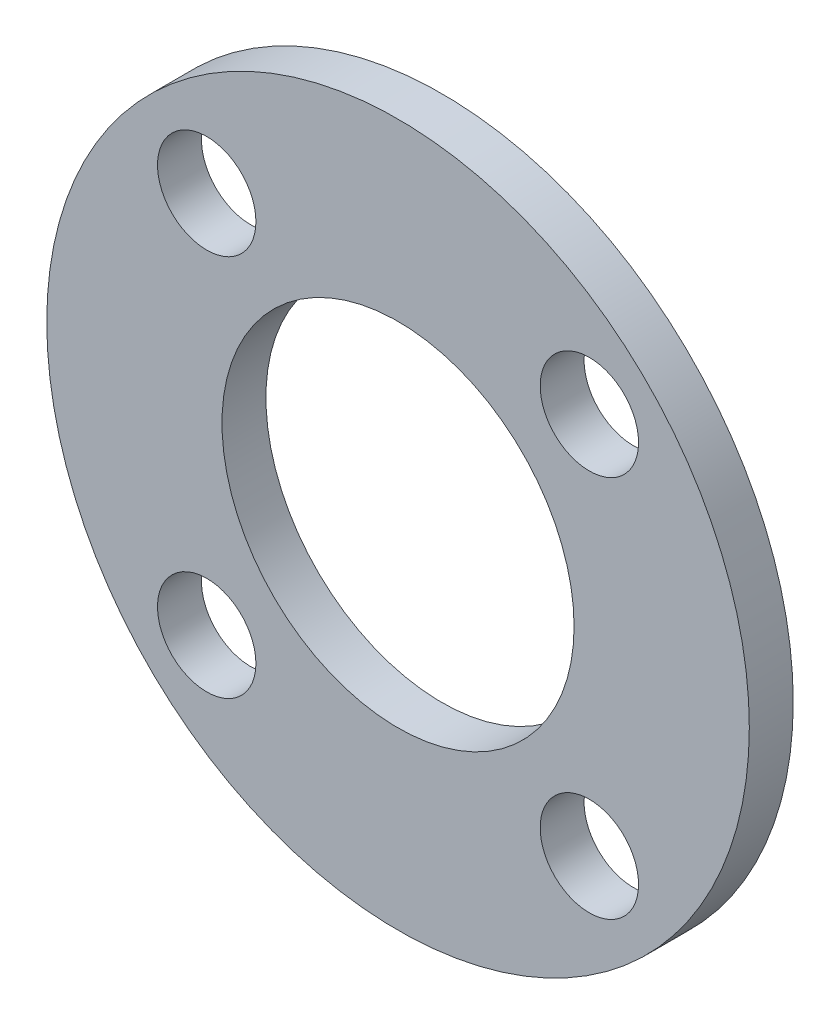
ISO-10303-21;
HEADER;
FILE_DESCRIPTION(('STEP AP214'),'2;1');
FILE_NAME('part.step','',(''),(''),'','','');
FILE_SCHEMA(('AUTOMOTIVE_DESIGN { 1 0 10303 214 1 1 1 1 }'));
ENDSEC;
DATA;
#1=APPLICATION_CONTEXT('core data for automotive mechanical design processes');
#2=APPLICATION_PROTOCOL_DEFINITION('international standard','automotive_design',2000,#1);
#3=PRODUCT_CONTEXT('',#1,'mechanical');
#4=PRODUCT('Part','Part','',(#3));
#5=PRODUCT_RELATED_PRODUCT_CATEGORY('part','',(#4));
#6=PRODUCT_DEFINITION_FORMATION('','',#4);
#7=PRODUCT_DEFINITION_CONTEXT('part definition',#1,'design');
#8=PRODUCT_DEFINITION('design','',#6,#7);
#9=PRODUCT_DEFINITION_SHAPE('','',#8);
#10=(LENGTH_UNIT() NAMED_UNIT(*) SI_UNIT(.MILLI.,.METRE.));
#11=(NAMED_UNIT(*) PLANE_ANGLE_UNIT() SI_UNIT($,.RADIAN.));
#12=(NAMED_UNIT(*) SI_UNIT($,.STERADIAN.) SOLID_ANGLE_UNIT());
#13=UNCERTAINTY_MEASURE_WITH_UNIT(LENGTH_MEASURE(1.E-05),#10,'distance_accuracy_value','');
#14=(GEOMETRIC_REPRESENTATION_CONTEXT(3) GLOBAL_UNCERTAINTY_ASSIGNED_CONTEXT((#13)) GLOBAL_UNIT_ASSIGNED_CONTEXT((#10,
#11,#12)) REPRESENTATION_CONTEXT('',''));
#15=CARTESIAN_POINT('',(0.,0.,0.));
#16=DIRECTION('',(0.,0.,1.));
#17=DIRECTION('',(1.,0.,0.));
#18=AXIS2_PLACEMENT_3D('',#15,#16,#17);
#19=CARTESIAN_POINT('',(0.,0.,3.175));
#20=DIRECTION('',(0.,0.,-1.));
#21=DIRECTION('',(-1.,0.,0.));
#22=AXIS2_PLACEMENT_3D('',#19,#20,#21);
#23=CYLINDRICAL_SURFACE('',#22,12.69619);
#24=CARTESIAN_POINT('',(0.,0.,0.));
#25=DIRECTION('',(0.,0.,-1.));
#26=DIRECTION('',(-1.,0.,0.));
#27=AXIS2_PLACEMENT_3D('',#24,#25,#26);
#28=CIRCLE('',#27,12.69619);
#29=CARTESIAN_POINT('',(-12.69619,0.,0.));
#30=VERTEX_POINT('',#29);
#31=EDGE_CURVE('E12',#30,#30,#28,.F.);
#32=ORIENTED_EDGE('',*,*,#31,.T.);
#33=EDGE_LOOP('',(#32));
#34=FACE_BOUND('',#33,.T.);
#35=CARTESIAN_POINT('',(0.,0.,1.5875));
#36=DIRECTION('',(0.,0.,1.));
#37=DIRECTION('',(1.,0.,0.));
#38=AXIS2_PLACEMENT_3D('',#35,#36,#37);
#39=CIRCLE('',#38,12.69619);
#40=CARTESIAN_POINT('',(12.69619,0.,1.5875));
#41=VERTEX_POINT('',#40);
#42=EDGE_CURVE('E89',#41,#41,#39,.F.);
#43=ORIENTED_EDGE('',*,*,#42,.T.);
#44=EDGE_LOOP('',(#43));
#45=FACE_BOUND('',#44,.T.);
#46=ADVANCED_FACE('F55',(#34,#45),#23,.T.);
#47=CARTESIAN_POINT('',(0.,0.,3.175));
#48=DIRECTION('',(0.,0.,1.));
#49=DIRECTION('',(1.,0.,0.));
#50=AXIS2_PLACEMENT_3D('',#47,#48,#49);
#51=CYLINDRICAL_SURFACE('',#50,6.36270000000001);
#52=CARTESIAN_POINT('',(0.,0.,0.));
#53=DIRECTION('',(0.,0.,1.));
#54=DIRECTION('',(1.,0.,0.));
#55=AXIS2_PLACEMENT_3D('',#52,#53,#54);
#56=CIRCLE('',#55,6.36270000000001);
#57=CARTESIAN_POINT('',(6.36270000000001,0.,0.));
#58=VERTEX_POINT('',#57);
#59=EDGE_CURVE('E65',#58,#58,#56,.T.);
#60=ORIENTED_EDGE('',*,*,#59,.F.);
#61=EDGE_LOOP('',(#60));
#62=FACE_BOUND('',#61,.T.);
#63=CARTESIAN_POINT('',(0.,0.,1.5875));
#64=DIRECTION('',(0.,0.,1.));
#65=DIRECTION('',(1.,0.,0.));
#66=AXIS2_PLACEMENT_3D('',#63,#64,#65);
#67=CIRCLE('',#66,6.36270000000001);
#68=CARTESIAN_POINT('',(6.36270000000001,0.,1.5875));
#69=VERTEX_POINT('',#68);
#70=EDGE_CURVE('E93',#69,#69,#67,.F.);
#71=ORIENTED_EDGE('',*,*,#70,.F.);
#72=EDGE_LOOP('',(#71));
#73=FACE_BOUND('',#72,.T.);
#74=ADVANCED_FACE('F133',(#62,#73),#51,.F.);
#75=CARTESIAN_POINT('',(-6.91479721322323,6.91479721322326,3.175));
#76=DIRECTION('',(0.,0.,1.));
#77=DIRECTION('',(1.,0.,0.));
#78=AXIS2_PLACEMENT_3D('',#75,#76,#77);
#79=CYLINDRICAL_SURFACE('',#78,1.77799999999998);
#80=CARTESIAN_POINT('',(-6.91479721322323,6.91479721322326,0.));
#81=DIRECTION('',(0.,0.,1.));
#82=DIRECTION('',(1.,0.,0.));
#83=AXIS2_PLACEMENT_3D('',#80,#81,#82);
#84=CIRCLE('',#83,1.77799999999998);
#85=CARTESIAN_POINT('',(-5.13679721322325,6.91479721322326,0.));
#86=VERTEX_POINT('',#85);
#87=EDGE_CURVE('E71',#86,#86,#84,.T.);
#88=ORIENTED_EDGE('',*,*,#87,.F.);
#89=EDGE_LOOP('',(#88));
#90=FACE_BOUND('',#89,.T.);
#91=CARTESIAN_POINT('',(-6.91479721322323,6.91479721322326,1.5875));
#92=DIRECTION('',(0.,0.,1.));
#93=DIRECTION('',(1.,0.,0.));
#94=AXIS2_PLACEMENT_3D('',#91,#92,#93);
#95=CIRCLE('',#94,1.77799999999998);
#96=CARTESIAN_POINT('',(-5.13679721322325,6.91479721322326,1.5875));
#97=VERTEX_POINT('',#96);
#98=EDGE_CURVE('E97',#97,#97,#95,.F.);
#99=ORIENTED_EDGE('',*,*,#98,.F.);
#100=EDGE_LOOP('',(#99));
#101=FACE_BOUND('',#100,.T.);
#102=ADVANCED_FACE('F137',(#90,#101),#79,.F.);
#103=CARTESIAN_POINT('',(6.91479721322328,6.91479721322321,3.175));
#104=DIRECTION('',(0.,0.,1.));
#105=DIRECTION('',(1.,0.,0.));
#106=AXIS2_PLACEMENT_3D('',#103,#104,#105);
#107=CYLINDRICAL_SURFACE('',#106,1.77799999999998);
#108=CARTESIAN_POINT('',(6.91479721322328,6.91479721322321,0.));
#109=DIRECTION('',(0.,0.,1.));
#110=DIRECTION('',(1.,0.,0.));
#111=AXIS2_PLACEMENT_3D('',#108,#109,#110);
#112=CIRCLE('',#111,1.77799999999998);
#113=CARTESIAN_POINT('',(8.69279721322327,6.91479721322321,0.));
#114=VERTEX_POINT('',#113);
#115=EDGE_CURVE('E77',#114,#114,#112,.T.);
#116=ORIENTED_EDGE('',*,*,#115,.F.);
#117=EDGE_LOOP('',(#116));
#118=FACE_BOUND('',#117,.T.);
#119=CARTESIAN_POINT('',(6.91479721322328,6.91479721322321,1.5875));
#120=DIRECTION('',(0.,0.,1.));
#121=DIRECTION('',(1.,0.,0.));
#122=AXIS2_PLACEMENT_3D('',#119,#120,#121);
#123=CIRCLE('',#122,1.77799999999998);
#124=CARTESIAN_POINT('',(8.69279721322327,6.91479721322321,1.5875));
#125=VERTEX_POINT('',#124);
#126=EDGE_CURVE('E101',#125,#125,#123,.F.);
#127=ORIENTED_EDGE('',*,*,#126,.F.);
#128=EDGE_LOOP('',(#127));
#129=FACE_BOUND('',#128,.T.);
#130=ADVANCED_FACE('F127',(#118,#129),#107,.F.);
#131=CARTESIAN_POINT('',(6.91479721322323,-6.91479721322326,3.175));
#132=DIRECTION('',(0.,0.,1.));
#133=DIRECTION('',(1.,0.,0.));
#134=AXIS2_PLACEMENT_3D('',#131,#132,#133);
#135=CYLINDRICAL_SURFACE('',#134,1.77799999999999);
#136=CARTESIAN_POINT('',(6.91479721322323,-6.91479721322326,0.));
#137=DIRECTION('',(0.,0.,1.));
#138=DIRECTION('',(1.,0.,0.));
#139=AXIS2_PLACEMENT_3D('',#136,#137,#138);
#140=CIRCLE('',#139,1.77799999999999);
#141=CARTESIAN_POINT('',(8.69279721322322,-6.91479721322326,0.));
#142=VERTEX_POINT('',#141);
#143=EDGE_CURVE('E81',#142,#142,#140,.T.);
#144=ORIENTED_EDGE('',*,*,#143,.F.);
#145=EDGE_LOOP('',(#144));
#146=FACE_BOUND('',#145,.T.);
#147=CARTESIAN_POINT('',(6.91479721322323,-6.91479721322326,1.5875));
#148=DIRECTION('',(0.,0.,1.));
#149=DIRECTION('',(1.,0.,0.));
#150=AXIS2_PLACEMENT_3D('',#147,#148,#149);
#151=CIRCLE('',#150,1.77799999999999);
#152=CARTESIAN_POINT('',(8.69279721322322,-6.91479721322326,1.5875));
#153=VERTEX_POINT('',#152);
#154=EDGE_CURVE('E105',#153,#153,#151,.F.);
#155=ORIENTED_EDGE('',*,*,#154,.F.);
#156=EDGE_LOOP('',(#155));
#157=FACE_BOUND('',#156,.T.);
#158=ADVANCED_FACE('F118',(#146,#157),#135,.F.);
#159=CARTESIAN_POINT('',(-6.91479721322333,-6.91479721322316,3.175));
#160=DIRECTION('',(0.,0.,1.));
#161=DIRECTION('',(1.,0.,0.));
#162=AXIS2_PLACEMENT_3D('',#159,#160,#161);
#163=CYLINDRICAL_SURFACE('',#162,1.77799999999998);
#164=CARTESIAN_POINT('',(-6.91479721322333,-6.91479721322316,0.));
#165=DIRECTION('',(0.,0.,1.));
#166=DIRECTION('',(1.,0.,0.));
#167=AXIS2_PLACEMENT_3D('',#164,#165,#166);
#168=CIRCLE('',#167,1.77799999999998);
#169=CARTESIAN_POINT('',(-5.13679721322335,-6.91479721322316,0.));
#170=VERTEX_POINT('',#169);
#171=EDGE_CURVE('E85',#170,#170,#168,.T.);
#172=ORIENTED_EDGE('',*,*,#171,.F.);
#173=EDGE_LOOP('',(#172));
#174=FACE_BOUND('',#173,.T.);
#175=CARTESIAN_POINT('',(-6.91479721322333,-6.91479721322316,1.5875));
#176=DIRECTION('',(0.,0.,1.));
#177=DIRECTION('',(1.,0.,0.));
#178=AXIS2_PLACEMENT_3D('',#175,#176,#177);
#179=CIRCLE('',#178,1.77799999999998);
#180=CARTESIAN_POINT('',(-5.13679721322335,-6.91479721322316,1.5875));
#181=VERTEX_POINT('',#180);
#182=EDGE_CURVE('E60',#181,#181,#179,.F.);
#183=ORIENTED_EDGE('',*,*,#182,.F.);
#184=EDGE_LOOP('',(#183));
#185=FACE_BOUND('',#184,.T.);
#186=ADVANCED_FACE('F116',(#174,#185),#163,.F.);
#187=CARTESIAN_POINT('',(0.,0.,0.));
#188=DIRECTION('',(0.,0.,1.));
#189=DIRECTION('',(1.,0.,0.));
#190=AXIS2_PLACEMENT_3D('',#187,#188,#189);
#191=PLANE('',#190);
#192=ORIENTED_EDGE('',*,*,#171,.T.);
#193=EDGE_LOOP('',(#192));
#194=FACE_BOUND('',#193,.T.);
#195=ORIENTED_EDGE('',*,*,#143,.T.);
#196=EDGE_LOOP('',(#195));
#197=FACE_BOUND('',#196,.T.);
#198=ORIENTED_EDGE('',*,*,#115,.T.);
#199=EDGE_LOOP('',(#198));
#200=FACE_BOUND('',#199,.T.);
#201=ORIENTED_EDGE('',*,*,#87,.T.);
#202=EDGE_LOOP('',(#201));
#203=FACE_BOUND('',#202,.T.);
#204=ORIENTED_EDGE('',*,*,#59,.T.);
#205=EDGE_LOOP('',(#204));
#206=FACE_BOUND('',#205,.T.);
#207=ORIENTED_EDGE('',*,*,#31,.F.);
#208=EDGE_LOOP('',(#207));
#209=FACE_BOUND('',#208,.T.);
#210=ADVANCED_FACE('F57',(#194,#197,#200,#203,#206,#209),#191,.F.);
#211=CARTESIAN_POINT('',(0.,0.,1.5875));
#212=DIRECTION('',(0.,0.,1.));
#213=DIRECTION('',(1.,0.,0.));
#214=AXIS2_PLACEMENT_3D('',#211,#212,#213);
#215=PLANE('',#214);
#216=ORIENTED_EDGE('',*,*,#42,.F.);
#217=EDGE_LOOP('',(#216));
#218=FACE_BOUND('',#217,.T.);
#219=ORIENTED_EDGE('',*,*,#70,.T.);
#220=EDGE_LOOP('',(#219));
#221=FACE_BOUND('',#220,.T.);
#222=ORIENTED_EDGE('',*,*,#98,.T.);
#223=EDGE_LOOP('',(#222));
#224=FACE_BOUND('',#223,.T.);
#225=ORIENTED_EDGE('',*,*,#126,.T.);
#226=EDGE_LOOP('',(#225));
#227=FACE_BOUND('',#226,.T.);
#228=ORIENTED_EDGE('',*,*,#154,.T.);
#229=EDGE_LOOP('',(#228));
#230=FACE_BOUND('',#229,.T.);
#231=ORIENTED_EDGE('',*,*,#182,.T.);
#232=EDGE_LOOP('',(#231));
#233=FACE_BOUND('',#232,.T.);
#234=ADVANCED_FACE('F114',(#218,#221,#224,#227,#230,#233),#215,.T.);
#235=CLOSED_SHELL('',(#46,#74,#102,#130,#158,#186,#210,#234));
#236=MANIFOLD_SOLID_BREP('B2',#235);
#237=ADVANCED_BREP_SHAPE_REPRESENTATION('',(#18,#236),#14);
#238=SHAPE_DEFINITION_REPRESENTATION(#9,#237);
ENDSEC;
END-ISO-10303-21;
